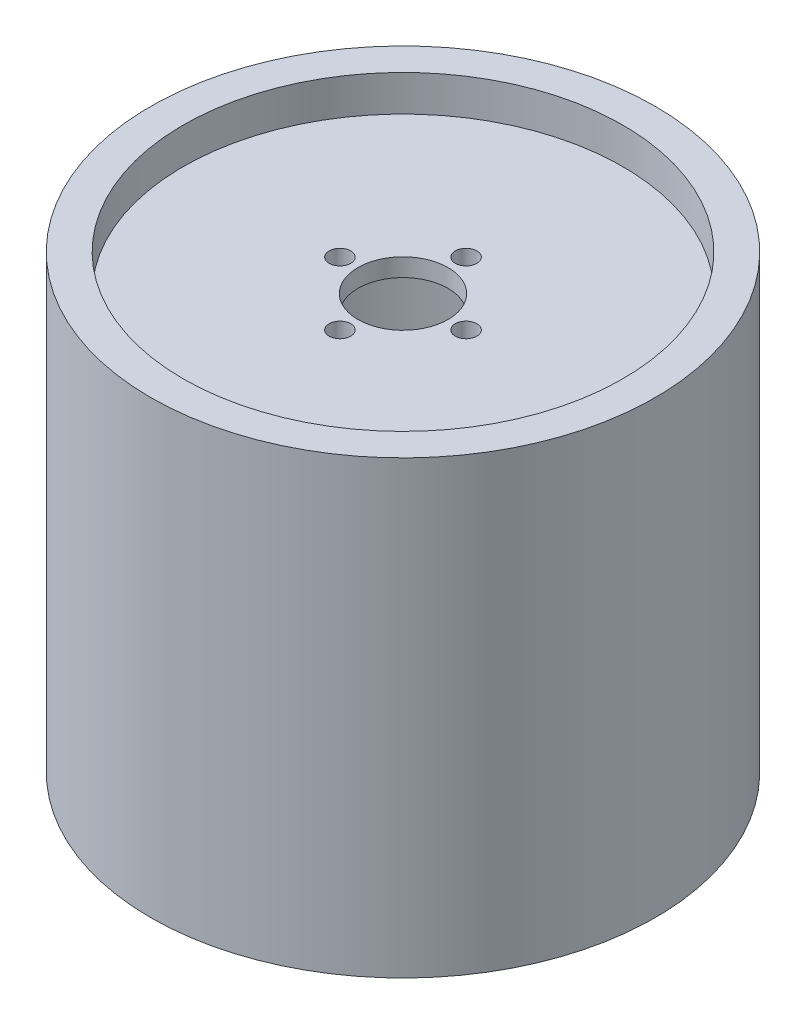
ISO-10303-21;
HEADER;
FILE_DESCRIPTION(('STEP AP214'),'2;1');
FILE_NAME('part.step','',(''),(''),'','','');
FILE_SCHEMA(('AUTOMOTIVE_DESIGN { 1 0 10303 214 1 1 1 1 }'));
ENDSEC;
DATA;
#1=APPLICATION_CONTEXT('core data for automotive mechanical design processes');
#2=APPLICATION_PROTOCOL_DEFINITION('international standard','automotive_design',2000,#1);
#3=PRODUCT_CONTEXT('',#1,'mechanical');
#4=PRODUCT('Part','Part','',(#3));
#5=PRODUCT_RELATED_PRODUCT_CATEGORY('part','',(#4));
#6=PRODUCT_DEFINITION_FORMATION('','',#4);
#7=PRODUCT_DEFINITION_CONTEXT('part definition',#1,'design');
#8=PRODUCT_DEFINITION('design','',#6,#7);
#9=PRODUCT_DEFINITION_SHAPE('','',#8);
#10=(LENGTH_UNIT() NAMED_UNIT(*) SI_UNIT(.MILLI.,.METRE.));
#11=(NAMED_UNIT(*) PLANE_ANGLE_UNIT() SI_UNIT($,.RADIAN.));
#12=(NAMED_UNIT(*) SI_UNIT($,.STERADIAN.) SOLID_ANGLE_UNIT());
#13=UNCERTAINTY_MEASURE_WITH_UNIT(LENGTH_MEASURE(1.E-05),#10,'distance_accuracy_value','');
#14=(GEOMETRIC_REPRESENTATION_CONTEXT(3) GLOBAL_UNCERTAINTY_ASSIGNED_CONTEXT((#13)) GLOBAL_UNIT_ASSIGNED_CONTEXT((#10,
#11,#12)) REPRESENTATION_CONTEXT('',''));
#15=CARTESIAN_POINT('',(0.,0.,0.));
#16=DIRECTION('',(0.,0.,1.));
#17=DIRECTION('',(1.,0.,0.));
#18=AXIS2_PLACEMENT_3D('',#15,#16,#17);
#19=CARTESIAN_POINT('',(0.,110.,0.));
#20=DIRECTION('',(0.,-1.,0.));
#21=DIRECTION('',(0.,0.,-1.));
#22=AXIS2_PLACEMENT_3D('',#19,#20,#21);
#23=CYLINDRICAL_SURFACE('',#22,60.);
#24=CARTESIAN_POINT('',(0.,110.,0.));
#25=DIRECTION('',(0.,-1.,0.));
#26=DIRECTION('',(0.,0.,-1.));
#27=AXIS2_PLACEMENT_3D('',#24,#25,#26);
#28=CIRCLE('',#27,60.);
#29=CARTESIAN_POINT('',(0.,110.,-60.));
#30=VERTEX_POINT('',#29);
#31=EDGE_CURVE('E48',#30,#30,#28,.T.);
#32=ORIENTED_EDGE('',*,*,#31,.F.);
#33=EDGE_LOOP('',(#32));
#34=FACE_BOUND('',#33,.T.);
#35=CARTESIAN_POINT('',(0.,5.,0.));
#36=DIRECTION('',(0.,-1.,0.));
#37=DIRECTION('',(0.,0.,-1.));
#38=AXIS2_PLACEMENT_3D('',#35,#36,#37);
#39=CIRCLE('',#38,60.);
#40=CARTESIAN_POINT('',(0.,5.,-60.));
#41=VERTEX_POINT('',#40);
#42=EDGE_CURVE('E10',#41,#41,#39,.F.);
#43=ORIENTED_EDGE('',*,*,#42,.F.);
#44=EDGE_LOOP('',(#43));
#45=FACE_BOUND('',#44,.T.);
#46=ADVANCED_FACE('F32',(#34,#45),#23,.F.);
#47=CARTESIAN_POINT('',(0.,125.,0.));
#48=DIRECTION('',(0.,-1.,0.));
#49=DIRECTION('',(0.,0.,-1.));
#50=AXIS2_PLACEMENT_3D('',#47,#48,#49);
#51=CYLINDRICAL_SURFACE('',#50,70.);
#52=CARTESIAN_POINT('',(0.,125.,0.));
#53=DIRECTION('',(0.,1.,0.));
#54=DIRECTION('',(0.,0.,1.));
#55=AXIS2_PLACEMENT_3D('',#52,#53,#54);
#56=CIRCLE('',#55,70.);
#57=CARTESIAN_POINT('',(0.,125.,70.));
#58=VERTEX_POINT('',#57);
#59=EDGE_CURVE('E39',#58,#58,#56,.T.);
#60=ORIENTED_EDGE('',*,*,#59,.F.);
#61=EDGE_LOOP('',(#60));
#62=FACE_BOUND('',#61,.T.);
#63=CARTESIAN_POINT('',(0.,0.,0.));
#64=DIRECTION('',(0.,1.,0.));
#65=DIRECTION('',(0.,0.,1.));
#66=AXIS2_PLACEMENT_3D('',#63,#64,#65);
#67=CIRCLE('',#66,70.);
#68=CARTESIAN_POINT('',(0.,0.,70.));
#69=VERTEX_POINT('',#68);
#70=EDGE_CURVE('E43',#69,#69,#67,.T.);
#71=ORIENTED_EDGE('',*,*,#70,.T.);
#72=EDGE_LOOP('',(#71));
#73=FACE_BOUND('',#72,.T.);
#74=ADVANCED_FACE('F34',(#62,#73),#51,.T.);
#75=CARTESIAN_POINT('',(0.,125.,0.));
#76=DIRECTION('',(0.,1.,0.));
#77=DIRECTION('',(0.,0.,1.));
#78=AXIS2_PLACEMENT_3D('',#75,#76,#77);
#79=PLANE('',#78);
#80=CARTESIAN_POINT('',(0.,125.,0.));
#81=DIRECTION('',(0.,1.,0.));
#82=DIRECTION('',(0.,0.,1.));
#83=AXIS2_PLACEMENT_3D('',#80,#81,#82);
#84=CIRCLE('',#83,61.);
#85=CARTESIAN_POINT('',(0.,125.,61.));
#86=VERTEX_POINT('',#85);
#87=EDGE_CURVE('E54',#86,#86,#84,.T.);
#88=ORIENTED_EDGE('',*,*,#87,.F.);
#89=EDGE_LOOP('',(#88));
#90=FACE_BOUND('',#89,.T.);
#91=ORIENTED_EDGE('',*,*,#59,.T.);
#92=EDGE_LOOP('',(#91));
#93=FACE_BOUND('',#92,.T.);
#94=ADVANCED_FACE('F84',(#90,#93),#79,.T.);
#95=CARTESIAN_POINT('',(0.,0.,0.));
#96=DIRECTION('',(0.,1.,0.));
#97=DIRECTION('',(0.,0.,1.));
#98=AXIS2_PLACEMENT_3D('',#95,#96,#97);
#99=PLANE('',#98);
#100=CARTESIAN_POINT('',(0.,0.,-55.));
#101=DIRECTION('',(0.,-1.,0.));
#102=DIRECTION('',(0.,0.,-1.));
#103=AXIS2_PLACEMENT_3D('',#100,#101,#102);
#104=CIRCLE('',#103,2.5);
#105=CARTESIAN_POINT('',(0.,0.,-57.5));
#106=VERTEX_POINT('',#105);
#107=EDGE_CURVE('E102',#106,#106,#104,.T.);
#108=ORIENTED_EDGE('',*,*,#107,.F.);
#109=EDGE_LOOP('',(#108));
#110=FACE_BOUND('',#109,.T.);
#111=CARTESIAN_POINT('',(-55.,0.,1.92031473636372E-13));
#112=DIRECTION('',(0.,-1.,0.));
#113=DIRECTION('',(0.,0.,-1.));
#114=AXIS2_PLACEMENT_3D('',#111,#112,#113);
#115=CIRCLE('',#114,2.5);
#116=CARTESIAN_POINT('',(-55.,0.,-2.49999999999981));
#117=VERTEX_POINT('',#116);
#118=EDGE_CURVE('E106',#117,#117,#115,.T.);
#119=ORIENTED_EDGE('',*,*,#118,.F.);
#120=EDGE_LOOP('',(#119));
#121=FACE_BOUND('',#120,.T.);
#122=CARTESIAN_POINT('',(3.84062947272745E-13,0.,55.));
#123=DIRECTION('',(0.,-1.,0.));
#124=DIRECTION('',(0.,0.,-1.));
#125=AXIS2_PLACEMENT_3D('',#122,#123,#124);
#126=CIRCLE('',#125,2.5);
#127=CARTESIAN_POINT('',(3.84062947272745E-13,0.,52.5));
#128=VERTEX_POINT('',#127);
#129=EDGE_CURVE('E110',#128,#128,#126,.T.);
#130=ORIENTED_EDGE('',*,*,#129,.F.);
#131=EDGE_LOOP('',(#130));
#132=FACE_BOUND('',#131,.T.);
#133=CARTESIAN_POINT('',(55.,0.,-5.76094420909117E-13));
#134=DIRECTION('',(0.,-1.,0.));
#135=DIRECTION('',(0.,0.,-1.));
#136=AXIS2_PLACEMENT_3D('',#133,#134,#135);
#137=CIRCLE('',#136,2.5);
#138=CARTESIAN_POINT('',(55.,0.,-2.50000000000058));
#139=VERTEX_POINT('',#138);
#140=EDGE_CURVE('E114',#139,#139,#137,.T.);
#141=ORIENTED_EDGE('',*,*,#140,.F.);
#142=EDGE_LOOP('',(#141));
#143=FACE_BOUND('',#142,.T.);
#144=ORIENTED_EDGE('',*,*,#70,.F.);
#145=EDGE_LOOP('',(#144));
#146=FACE_BOUND('',#145,.T.);
#147=CARTESIAN_POINT('',(0.,0.,0.));
#148=DIRECTION('',(0.,-1.,0.));
#149=DIRECTION('',(0.,0.,-1.));
#150=AXIS2_PLACEMENT_3D('',#147,#148,#149);
#151=CIRCLE('',#150,50.);
#152=CARTESIAN_POINT('',(0.,0.,-50.));
#153=VERTEX_POINT('',#152);
#154=EDGE_CURVE('E119',#153,#153,#151,.T.);
#155=ORIENTED_EDGE('',*,*,#154,.F.);
#156=EDGE_LOOP('',(#155));
#157=FACE_BOUND('',#156,.T.);
#158=ADVANCED_FACE('F90',(#110,#121,#132,#143,#146,#157),#99,.F.);
#159=CARTESIAN_POINT('',(0.,110.,0.));
#160=DIRECTION('',(0.,-1.,0.));
#161=DIRECTION('',(0.,0.,-1.));
#162=AXIS2_PLACEMENT_3D('',#159,#160,#161);
#163=PLANE('',#162);
#164=CARTESIAN_POINT('',(0.,110.,17.5));
#165=DIRECTION('',(0.,-1.,0.));
#166=DIRECTION('',(0.,0.,-1.));
#167=AXIS2_PLACEMENT_3D('',#164,#165,#166);
#168=CIRCLE('',#167,3.);
#169=CARTESIAN_POINT('',(0.,110.,14.5));
#170=VERTEX_POINT('',#169);
#171=EDGE_CURVE('E55',#170,#170,#168,.T.);
#172=ORIENTED_EDGE('',*,*,#171,.F.);
#173=EDGE_LOOP('',(#172));
#174=FACE_BOUND('',#173,.T.);
#175=CARTESIAN_POINT('',(-17.5,110.,0.));
#176=DIRECTION('',(0.,-1.,0.));
#177=DIRECTION('',(0.,0.,-1.));
#178=AXIS2_PLACEMENT_3D('',#175,#176,#177);
#179=CIRCLE('',#178,3.);
#180=CARTESIAN_POINT('',(-17.5,110.,-3.00000000000006));
#181=VERTEX_POINT('',#180);
#182=EDGE_CURVE('E61',#181,#181,#179,.T.);
#183=ORIENTED_EDGE('',*,*,#182,.F.);
#184=EDGE_LOOP('',(#183));
#185=FACE_BOUND('',#184,.T.);
#186=CARTESIAN_POINT('',(1.20058714961002E-13,110.,-17.5));
#187=DIRECTION('',(0.,-1.,0.));
#188=DIRECTION('',(0.,0.,-1.));
#189=AXIS2_PLACEMENT_3D('',#186,#187,#188);
#190=CIRCLE('',#189,3.);
#191=CARTESIAN_POINT('',(1.20058714961002E-13,110.,-20.5));
#192=VERTEX_POINT('',#191);
#193=EDGE_CURVE('E66',#192,#192,#190,.T.);
#194=ORIENTED_EDGE('',*,*,#193,.F.);
#195=EDGE_LOOP('',(#194));
#196=FACE_BOUND('',#195,.T.);
#197=CARTESIAN_POINT('',(17.5,110.,1.81159638390757E-13));
#198=DIRECTION('',(0.,-1.,0.));
#199=DIRECTION('',(0.,0.,-1.));
#200=AXIS2_PLACEMENT_3D('',#197,#198,#199);
#201=CIRCLE('',#200,3.);
#202=CARTESIAN_POINT('',(17.5,110.,-2.99999999999982));
#203=VERTEX_POINT('',#202);
#204=EDGE_CURVE('E145',#203,#203,#201,.T.);
#205=ORIENTED_EDGE('',*,*,#204,.F.);
#206=EDGE_LOOP('',(#205));
#207=FACE_BOUND('',#206,.T.);
#208=CARTESIAN_POINT('',(0.,110.,0.));
#209=DIRECTION('',(0.,-1.,0.));
#210=DIRECTION('',(0.,0.,-1.));
#211=AXIS2_PLACEMENT_3D('',#208,#209,#210);
#212=CIRCLE('',#211,12.5);
#213=CARTESIAN_POINT('',(0.,110.,-12.5));
#214=VERTEX_POINT('',#213);
#215=EDGE_CURVE('E52',#214,#214,#212,.T.);
#216=ORIENTED_EDGE('',*,*,#215,.F.);
#217=EDGE_LOOP('',(#216));
#218=FACE_BOUND('',#217,.T.);
#219=ORIENTED_EDGE('',*,*,#31,.T.);
#220=EDGE_LOOP('',(#219));
#221=FACE_BOUND('',#220,.T.);
#222=ADVANCED_FACE('F76',(#174,#185,#196,#207,#218,#221),#163,.T.);
#223=CARTESIAN_POINT('',(0.,115.,0.));
#224=DIRECTION('',(0.,1.,0.));
#225=DIRECTION('',(0.,0.,1.));
#226=AXIS2_PLACEMENT_3D('',#223,#224,#225);
#227=CYLINDRICAL_SURFACE('',#226,61.);
#228=CARTESIAN_POINT('',(0.,115.,0.));
#229=DIRECTION('',(0.,1.,0.));
#230=DIRECTION('',(0.,0.,1.));
#231=AXIS2_PLACEMENT_3D('',#228,#229,#230);
#232=CIRCLE('',#231,61.);
#233=CARTESIAN_POINT('',(0.,115.,61.));
#234=VERTEX_POINT('',#233);
#235=EDGE_CURVE('E59',#234,#234,#232,.T.);
#236=ORIENTED_EDGE('',*,*,#235,.F.);
#237=EDGE_LOOP('',(#236));
#238=FACE_BOUND('',#237,.T.);
#239=ORIENTED_EDGE('',*,*,#87,.T.);
#240=EDGE_LOOP('',(#239));
#241=FACE_BOUND('',#240,.T.);
#242=ADVANCED_FACE('F97',(#238,#241),#227,.F.);
#243=CARTESIAN_POINT('',(0.,115.,0.));
#244=DIRECTION('',(0.,1.,0.));
#245=DIRECTION('',(0.,0.,1.));
#246=AXIS2_PLACEMENT_3D('',#243,#244,#245);
#247=PLANE('',#246);
#248=CARTESIAN_POINT('',(0.,115.,0.));
#249=DIRECTION('',(0.,1.,0.));
#250=DIRECTION('',(0.,0.,1.));
#251=AXIS2_PLACEMENT_3D('',#248,#249,#250);
#252=CIRCLE('',#251,12.5);
#253=CARTESIAN_POINT('',(0.,115.,12.5));
#254=VERTEX_POINT('',#253);
#255=EDGE_CURVE('E140',#254,#254,#252,.T.);
#256=ORIENTED_EDGE('',*,*,#255,.F.);
#257=EDGE_LOOP('',(#256));
#258=FACE_BOUND('',#257,.T.);
#259=CARTESIAN_POINT('',(0.,115.,17.5));
#260=DIRECTION('',(0.,1.,0.));
#261=DIRECTION('',(0.,0.,1.));
#262=AXIS2_PLACEMENT_3D('',#259,#260,#261);
#263=CIRCLE('',#262,3.);
#264=CARTESIAN_POINT('',(0.,115.,20.5));
#265=VERTEX_POINT('',#264);
#266=EDGE_CURVE('E137',#265,#265,#263,.T.);
#267=ORIENTED_EDGE('',*,*,#266,.F.);
#268=EDGE_LOOP('',(#267));
#269=FACE_BOUND('',#268,.T.);
#270=CARTESIAN_POINT('',(-17.5,115.,0.));
#271=DIRECTION('',(0.,1.,0.));
#272=DIRECTION('',(0.,0.,1.));
#273=AXIS2_PLACEMENT_3D('',#270,#271,#272);
#274=CIRCLE('',#273,3.);
#275=CARTESIAN_POINT('',(-17.5,115.,2.99999999999994));
#276=VERTEX_POINT('',#275);
#277=EDGE_CURVE('E134',#276,#276,#274,.T.);
#278=ORIENTED_EDGE('',*,*,#277,.F.);
#279=EDGE_LOOP('',(#278));
#280=FACE_BOUND('',#279,.T.);
#281=CARTESIAN_POINT('',(1.20058714961002E-13,115.,-17.5));
#282=DIRECTION('',(0.,1.,0.));
#283=DIRECTION('',(0.,0.,1.));
#284=AXIS2_PLACEMENT_3D('',#281,#282,#283);
#285=CIRCLE('',#284,3.);
#286=CARTESIAN_POINT('',(1.20058714961002E-13,115.,-14.5));
#287=VERTEX_POINT('',#286);
#288=EDGE_CURVE('E131',#287,#287,#285,.T.);
#289=ORIENTED_EDGE('',*,*,#288,.F.);
#290=EDGE_LOOP('',(#289));
#291=FACE_BOUND('',#290,.T.);
#292=CARTESIAN_POINT('',(17.5,115.,1.81159638390757E-13));
#293=DIRECTION('',(0.,1.,0.));
#294=DIRECTION('',(0.,0.,1.));
#295=AXIS2_PLACEMENT_3D('',#292,#293,#294);
#296=CIRCLE('',#295,3.);
#297=CARTESIAN_POINT('',(17.5,115.,3.00000000000018));
#298=VERTEX_POINT('',#297);
#299=EDGE_CURVE('E125',#298,#298,#296,.T.);
#300=ORIENTED_EDGE('',*,*,#299,.F.);
#301=EDGE_LOOP('',(#300));
#302=FACE_BOUND('',#301,.T.);
#303=ORIENTED_EDGE('',*,*,#235,.T.);
#304=EDGE_LOOP('',(#303));
#305=FACE_BOUND('',#304,.T.);
#306=ADVANCED_FACE('F160',(#258,#269,#280,#291,#302,#305),#247,.T.);
#307=CARTESIAN_POINT('',(17.5,0.,1.81159638390757E-13));
#308=DIRECTION('',(0.,1.,0.));
#309=DIRECTION('',(0.,0.,1.));
#310=AXIS2_PLACEMENT_3D('',#307,#308,#309);
#311=CYLINDRICAL_SURFACE('',#310,3.);
#312=ORIENTED_EDGE('',*,*,#204,.T.);
#313=EDGE_LOOP('',(#312));
#314=FACE_BOUND('',#313,.T.);
#315=ORIENTED_EDGE('',*,*,#299,.T.);
#316=EDGE_LOOP('',(#315));
#317=FACE_BOUND('',#316,.T.);
#318=ADVANCED_FACE('F157',(#314,#317),#311,.F.);
#319=CARTESIAN_POINT('',(1.20058714961002E-13,0.,-17.5));
#320=DIRECTION('',(0.,1.,0.));
#321=DIRECTION('',(0.,0.,1.));
#322=AXIS2_PLACEMENT_3D('',#319,#320,#321);
#323=CYLINDRICAL_SURFACE('',#322,3.);
#324=ORIENTED_EDGE('',*,*,#193,.T.);
#325=EDGE_LOOP('',(#324));
#326=FACE_BOUND('',#325,.T.);
#327=ORIENTED_EDGE('',*,*,#288,.T.);
#328=EDGE_LOOP('',(#327));
#329=FACE_BOUND('',#328,.T.);
#330=ADVANCED_FACE('F150',(#326,#329),#323,.F.);
#331=CARTESIAN_POINT('',(-17.5,0.,0.));
#332=DIRECTION('',(0.,1.,0.));
#333=DIRECTION('',(0.,0.,1.));
#334=AXIS2_PLACEMENT_3D('',#331,#332,#333);
#335=CYLINDRICAL_SURFACE('',#334,3.);
#336=ORIENTED_EDGE('',*,*,#182,.T.);
#337=EDGE_LOOP('',(#336));
#338=FACE_BOUND('',#337,.T.);
#339=ORIENTED_EDGE('',*,*,#277,.T.);
#340=EDGE_LOOP('',(#339));
#341=FACE_BOUND('',#340,.T.);
#342=ADVANCED_FACE('F179',(#338,#341),#335,.F.);
#343=CARTESIAN_POINT('',(0.,0.,17.5));
#344=DIRECTION('',(0.,1.,0.));
#345=DIRECTION('',(0.,0.,1.));
#346=AXIS2_PLACEMENT_3D('',#343,#344,#345);
#347=CYLINDRICAL_SURFACE('',#346,3.);
#348=ORIENTED_EDGE('',*,*,#171,.T.);
#349=EDGE_LOOP('',(#348));
#350=FACE_BOUND('',#349,.T.);
#351=ORIENTED_EDGE('',*,*,#266,.T.);
#352=EDGE_LOOP('',(#351));
#353=FACE_BOUND('',#352,.T.);
#354=ADVANCED_FACE('F178',(#350,#353),#347,.F.);
#355=CARTESIAN_POINT('',(0.,0.,0.));
#356=DIRECTION('',(0.,1.,0.));
#357=DIRECTION('',(0.,0.,1.));
#358=AXIS2_PLACEMENT_3D('',#355,#356,#357);
#359=CYLINDRICAL_SURFACE('',#358,12.5);
#360=ORIENTED_EDGE('',*,*,#215,.T.);
#361=EDGE_LOOP('',(#360));
#362=FACE_BOUND('',#361,.T.);
#363=ORIENTED_EDGE('',*,*,#255,.T.);
#364=EDGE_LOOP('',(#363));
#365=FACE_BOUND('',#364,.T.);
#366=ADVANCED_FACE('F174',(#362,#365),#359,.F.);
#367=CARTESIAN_POINT('',(0.,5.,0.));
#368=DIRECTION('',(0.,-1.,0.));
#369=DIRECTION('',(0.,0.,-1.));
#370=AXIS2_PLACEMENT_3D('',#367,#368,#369);
#371=PLANE('',#370);
#372=CARTESIAN_POINT('',(0.,5.,-55.));
#373=DIRECTION('',(0.,-1.,0.));
#374=DIRECTION('',(0.,0.,-1.));
#375=AXIS2_PLACEMENT_3D('',#372,#373,#374);
#376=CIRCLE('',#375,2.5);
#377=CARTESIAN_POINT('',(0.,5.,-57.5));
#378=VERTEX_POINT('',#377);
#379=EDGE_CURVE('E122',#378,#378,#376,.T.);
#380=ORIENTED_EDGE('',*,*,#379,.T.);
#381=EDGE_LOOP('',(#380));
#382=FACE_BOUND('',#381,.T.);
#383=CARTESIAN_POINT('',(-55.,5.,1.92031473636372E-13));
#384=DIRECTION('',(0.,-1.,0.));
#385=DIRECTION('',(0.,0.,-1.));
#386=AXIS2_PLACEMENT_3D('',#383,#384,#385);
#387=CIRCLE('',#386,2.5);
#388=CARTESIAN_POINT('',(-55.,5.,-2.49999999999981));
#389=VERTEX_POINT('',#388);
#390=EDGE_CURVE('E213',#389,#389,#387,.T.);
#391=ORIENTED_EDGE('',*,*,#390,.T.);
#392=EDGE_LOOP('',(#391));
#393=FACE_BOUND('',#392,.T.);
#394=CARTESIAN_POINT('',(3.84062947272745E-13,5.,55.));
#395=DIRECTION('',(0.,-1.,0.));
#396=DIRECTION('',(0.,0.,-1.));
#397=AXIS2_PLACEMENT_3D('',#394,#395,#396);
#398=CIRCLE('',#397,2.5);
#399=CARTESIAN_POINT('',(3.84062947272745E-13,5.,52.5));
#400=VERTEX_POINT('',#399);
#401=EDGE_CURVE('E219',#400,#400,#398,.T.);
#402=ORIENTED_EDGE('',*,*,#401,.T.);
#403=EDGE_LOOP('',(#402));
#404=FACE_BOUND('',#403,.T.);
#405=CARTESIAN_POINT('',(55.,5.,-5.76094420909117E-13));
#406=DIRECTION('',(0.,-1.,0.));
#407=DIRECTION('',(0.,0.,-1.));
#408=AXIS2_PLACEMENT_3D('',#405,#406,#407);
#409=CIRCLE('',#408,2.5);
#410=CARTESIAN_POINT('',(55.,5.,-2.50000000000058));
#411=VERTEX_POINT('',#410);
#412=EDGE_CURVE('E223',#411,#411,#409,.T.);
#413=ORIENTED_EDGE('',*,*,#412,.T.);
#414=EDGE_LOOP('',(#413));
#415=FACE_BOUND('',#414,.T.);
#416=CARTESIAN_POINT('',(0.,5.,0.));
#417=DIRECTION('',(0.,-1.,0.));
#418=DIRECTION('',(0.,0.,-1.));
#419=AXIS2_PLACEMENT_3D('',#416,#417,#418);
#420=CIRCLE('',#419,50.);
#421=CARTESIAN_POINT('',(0.,5.,-50.));
#422=VERTEX_POINT('',#421);
#423=EDGE_CURVE('E121',#422,#422,#420,.T.);
#424=ORIENTED_EDGE('',*,*,#423,.T.);
#425=EDGE_LOOP('',(#424));
#426=FACE_BOUND('',#425,.T.);
#427=ORIENTED_EDGE('',*,*,#42,.T.);
#428=EDGE_LOOP('',(#427));
#429=FACE_BOUND('',#428,.T.);
#430=ADVANCED_FACE('F177',(#382,#393,#404,#415,#426,#429),#371,.F.);
#431=CARTESIAN_POINT('',(0.,5.,0.));
#432=DIRECTION('',(0.,-1.,0.));
#433=DIRECTION('',(0.,0.,-1.));
#434=AXIS2_PLACEMENT_3D('',#431,#432,#433);
#435=CYLINDRICAL_SURFACE('',#434,50.);
#436=ORIENTED_EDGE('',*,*,#423,.F.);
#437=EDGE_LOOP('',(#436));
#438=FACE_BOUND('',#437,.T.);
#439=ORIENTED_EDGE('',*,*,#154,.T.);
#440=EDGE_LOOP('',(#439));
#441=FACE_BOUND('',#440,.T.);
#442=ADVANCED_FACE('F189',(#438,#441),#435,.F.);
#443=CARTESIAN_POINT('',(55.,5.,-5.76094420909117E-13));
#444=DIRECTION('',(0.,-1.,0.));
#445=DIRECTION('',(0.,0.,-1.));
#446=AXIS2_PLACEMENT_3D('',#443,#444,#445);
#447=CYLINDRICAL_SURFACE('',#446,2.5);
#448=ORIENTED_EDGE('',*,*,#412,.F.);
#449=EDGE_LOOP('',(#448));
#450=FACE_BOUND('',#449,.T.);
#451=ORIENTED_EDGE('',*,*,#140,.T.);
#452=EDGE_LOOP('',(#451));
#453=FACE_BOUND('',#452,.T.);
#454=ADVANCED_FACE('F193',(#450,#453),#447,.F.);
#455=CARTESIAN_POINT('',(3.84062947272745E-13,5.,55.));
#456=DIRECTION('',(0.,-1.,0.));
#457=DIRECTION('',(0.,0.,-1.));
#458=AXIS2_PLACEMENT_3D('',#455,#456,#457);
#459=CYLINDRICAL_SURFACE('',#458,2.5);
#460=ORIENTED_EDGE('',*,*,#401,.F.);
#461=EDGE_LOOP('',(#460));
#462=FACE_BOUND('',#461,.T.);
#463=ORIENTED_EDGE('',*,*,#129,.T.);
#464=EDGE_LOOP('',(#463));
#465=FACE_BOUND('',#464,.T.);
#466=ADVANCED_FACE('F197',(#462,#465),#459,.F.);
#467=CARTESIAN_POINT('',(-55.,5.,1.92031473636372E-13));
#468=DIRECTION('',(0.,-1.,0.));
#469=DIRECTION('',(0.,0.,-1.));
#470=AXIS2_PLACEMENT_3D('',#467,#468,#469);
#471=CYLINDRICAL_SURFACE('',#470,2.5);
#472=ORIENTED_EDGE('',*,*,#390,.F.);
#473=EDGE_LOOP('',(#472));
#474=FACE_BOUND('',#473,.T.);
#475=ORIENTED_EDGE('',*,*,#118,.T.);
#476=EDGE_LOOP('',(#475));
#477=FACE_BOUND('',#476,.T.);
#478=ADVANCED_FACE('F201',(#474,#477),#471,.F.);
#479=CARTESIAN_POINT('',(0.,5.,-55.));
#480=DIRECTION('',(0.,-1.,0.));
#481=DIRECTION('',(0.,0.,-1.));
#482=AXIS2_PLACEMENT_3D('',#479,#480,#481);
#483=CYLINDRICAL_SURFACE('',#482,2.5);
#484=ORIENTED_EDGE('',*,*,#379,.F.);
#485=EDGE_LOOP('',(#484));
#486=FACE_BOUND('',#485,.T.);
#487=ORIENTED_EDGE('',*,*,#107,.T.);
#488=EDGE_LOOP('',(#487));
#489=FACE_BOUND('',#488,.T.);
#490=ADVANCED_FACE('F205',(#486,#489),#483,.F.);
#491=CLOSED_SHELL('',(#46,#74,#94,#158,#222,#242,#306,#318,#330,#342,#354,#366,#430,#442,#454,
#466,#478,#490));
#492=MANIFOLD_SOLID_BREP('B2',#491);
#493=ADVANCED_BREP_SHAPE_REPRESENTATION('',(#18,#492),#14);
#494=SHAPE_DEFINITION_REPRESENTATION(#9,#493);
ENDSEC;
END-ISO-10303-21;
